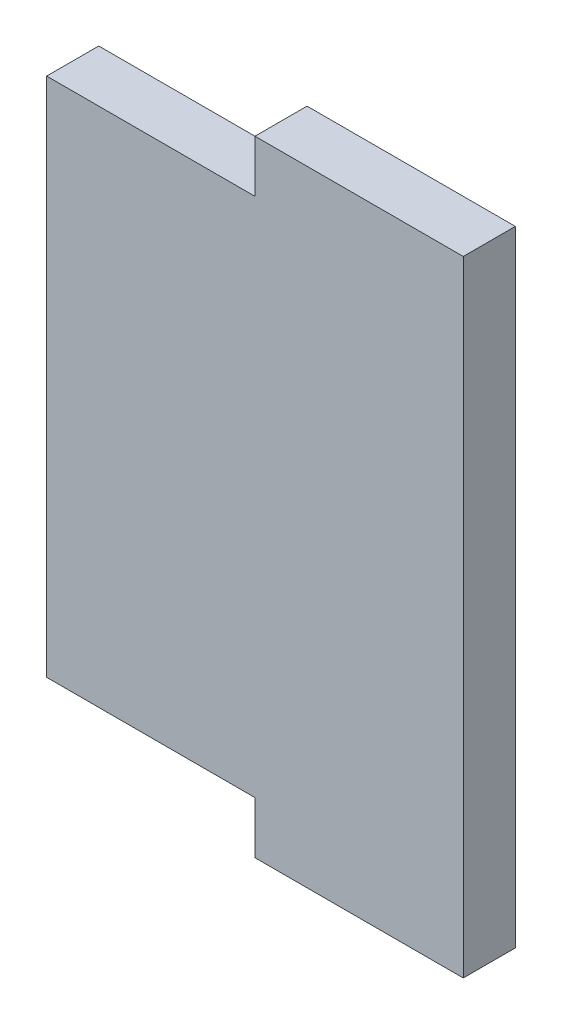
ISO-10303-21;
HEADER;
FILE_DESCRIPTION(('STEP AP214'),'2;1');
FILE_NAME('part.step','',(''),(''),'','','');
FILE_SCHEMA(('AUTOMOTIVE_DESIGN { 1 0 10303 214 1 1 1 1 }'));
ENDSEC;
DATA;
#1=APPLICATION_CONTEXT('core data for automotive mechanical design processes');
#2=APPLICATION_PROTOCOL_DEFINITION('international standard','automotive_design',2000,#1);
#3=PRODUCT_CONTEXT('',#1,'mechanical');
#4=PRODUCT('Part','Part','',(#3));
#5=PRODUCT_RELATED_PRODUCT_CATEGORY('part','',(#4));
#6=PRODUCT_DEFINITION_FORMATION('','',#4);
#7=PRODUCT_DEFINITION_CONTEXT('part definition',#1,'design');
#8=PRODUCT_DEFINITION('design','',#6,#7);
#9=PRODUCT_DEFINITION_SHAPE('','',#8);
#10=(LENGTH_UNIT() NAMED_UNIT(*) SI_UNIT(.MILLI.,.METRE.));
#11=(NAMED_UNIT(*) PLANE_ANGLE_UNIT() SI_UNIT($,.RADIAN.));
#12=(NAMED_UNIT(*) SI_UNIT($,.STERADIAN.) SOLID_ANGLE_UNIT());
#13=UNCERTAINTY_MEASURE_WITH_UNIT(LENGTH_MEASURE(1.E-05),#10,'distance_accuracy_value','');
#14=(GEOMETRIC_REPRESENTATION_CONTEXT(3) GLOBAL_UNCERTAINTY_ASSIGNED_CONTEXT((#13)) GLOBAL_UNIT_ASSIGNED_CONTEXT((#10,
#11,#12)) REPRESENTATION_CONTEXT('',''));
#15=CARTESIAN_POINT('',(0.,0.,0.));
#16=DIRECTION('',(0.,0.,1.));
#17=DIRECTION('',(1.,0.,0.));
#18=AXIS2_PLACEMENT_3D('',#15,#16,#17);
#19=CARTESIAN_POINT('',(174.625,0.,3.175));
#20=DIRECTION('',(0.,-1.,0.));
#21=DIRECTION('',(0.,0.,-1.));
#22=AXIS2_PLACEMENT_3D('',#19,#20,#21);
#23=PLANE('',#22);
#24=DIRECTION('',(-1.,0.,0.));
#25=VECTOR('',#24,1.);
#26=CARTESIAN_POINT('',(174.625,0.,0.));
#27=LINE('',#26,#25);
#28=CARTESIAN_POINT('',(174.625,0.,0.));
#29=VERTEX_POINT('',#28);
#30=CARTESIAN_POINT('',(161.925,0.,0.));
#31=VERTEX_POINT('',#30);
#32=EDGE_CURVE('E129',#29,#31,#27,.T.);
#33=ORIENTED_EDGE('',*,*,#32,.T.);
#34=DIRECTION('',(0.,0.,-1.));
#35=VECTOR('',#34,1.);
#36=CARTESIAN_POINT('',(161.925,0.,3.175));
#37=LINE('',#36,#35);
#38=CARTESIAN_POINT('',(161.925,0.,3.175));
#39=VERTEX_POINT('',#38);
#40=EDGE_CURVE('E11',#39,#31,#37,.T.);
#41=ORIENTED_EDGE('',*,*,#40,.F.);
#42=DIRECTION('',(-1.,0.,0.));
#43=VECTOR('',#42,1.);
#44=CARTESIAN_POINT('',(174.625,0.,3.175));
#45=LINE('',#44,#43);
#46=CARTESIAN_POINT('',(174.625,0.,3.175));
#47=VERTEX_POINT('',#46);
#48=EDGE_CURVE('E148',#47,#39,#45,.T.);
#49=ORIENTED_EDGE('',*,*,#48,.F.);
#50=DIRECTION('',(0.,0.,-1.));
#51=VECTOR('',#50,1.);
#52=CARTESIAN_POINT('',(174.625,0.,3.175));
#53=LINE('',#52,#51);
#54=EDGE_CURVE('E49',#47,#29,#53,.T.);
#55=ORIENTED_EDGE('',*,*,#54,.T.);
#56=EDGE_LOOP('',(#33,#41,#49,#55));
#57=FACE_BOUND('',#56,.T.);
#58=ADVANCED_FACE('F33',(#57),#23,.F.);
#59=CARTESIAN_POINT('',(161.925,0.,3.175));
#60=DIRECTION('',(1.,0.,0.));
#61=DIRECTION('',(0.,0.,-1.));
#62=AXIS2_PLACEMENT_3D('',#59,#60,#61);
#63=PLANE('',#62);
#64=DIRECTION('',(0.,-1.,0.));
#65=VECTOR('',#64,1.);
#66=CARTESIAN_POINT('',(161.925,0.,0.));
#67=LINE('',#66,#65);
#68=CARTESIAN_POINT('',(161.925,-3.175,0.));
#69=VERTEX_POINT('',#68);
#70=EDGE_CURVE('E131',#31,#69,#67,.T.);
#71=ORIENTED_EDGE('',*,*,#70,.T.);
#72=DIRECTION('',(0.,0.,-1.));
#73=VECTOR('',#72,1.);
#74=CARTESIAN_POINT('',(161.925,-3.175,3.175));
#75=LINE('',#74,#73);
#76=CARTESIAN_POINT('',(161.925,-3.175,3.175));
#77=VERTEX_POINT('',#76);
#78=EDGE_CURVE('E41',#77,#69,#75,.T.);
#79=ORIENTED_EDGE('',*,*,#78,.F.);
#80=DIRECTION('',(0.,-1.,0.));
#81=VECTOR('',#80,1.);
#82=CARTESIAN_POINT('',(161.925,0.,3.175));
#83=LINE('',#82,#81);
#84=EDGE_CURVE('E87',#39,#77,#83,.T.);
#85=ORIENTED_EDGE('',*,*,#84,.F.);
#86=ORIENTED_EDGE('',*,*,#40,.T.);
#87=EDGE_LOOP('',(#71,#79,#85,#86));
#88=FACE_BOUND('',#87,.T.);
#89=ADVANCED_FACE('F162',(#88),#63,.F.);
#90=CARTESIAN_POINT('',(149.225,-3.175,3.175));
#91=DIRECTION('',(0.,1.,0.));
#92=DIRECTION('',(0.,0.,1.));
#93=AXIS2_PLACEMENT_3D('',#90,#91,#92);
#94=PLANE('',#93);
#95=DIRECTION('',(1.,0.,0.));
#96=VECTOR('',#95,1.);
#97=CARTESIAN_POINT('',(149.225,-3.175,0.));
#98=LINE('',#97,#96);
#99=CARTESIAN_POINT('',(149.225,-3.175,0.));
#100=VERTEX_POINT('',#99);
#101=EDGE_CURVE('E134',#100,#69,#98,.T.);
#102=ORIENTED_EDGE('',*,*,#101,.F.);
#103=DIRECTION('',(0.,0.,-1.));
#104=VECTOR('',#103,1.);
#105=CARTESIAN_POINT('',(149.225,-3.175,3.175));
#106=LINE('',#105,#104);
#107=CARTESIAN_POINT('',(149.225,-3.175,3.175));
#108=VERTEX_POINT('',#107);
#109=EDGE_CURVE('E155',#108,#100,#106,.T.);
#110=ORIENTED_EDGE('',*,*,#109,.F.);
#111=DIRECTION('',(1.,0.,0.));
#112=VECTOR('',#111,1.);
#113=CARTESIAN_POINT('',(149.225,-3.175,3.175));
#114=LINE('',#113,#112);
#115=EDGE_CURVE('E161',#108,#77,#114,.T.);
#116=ORIENTED_EDGE('',*,*,#115,.T.);
#117=ORIENTED_EDGE('',*,*,#78,.T.);
#118=EDGE_LOOP('',(#102,#110,#116,#117));
#119=FACE_BOUND('',#118,.T.);
#120=ADVANCED_FACE('F159',(#119),#94,.T.);
#121=CARTESIAN_POINT('',(149.225,-3.175,3.175));
#122=DIRECTION('',(1.,0.,0.));
#123=DIRECTION('',(0.,0.,-1.));
#124=AXIS2_PLACEMENT_3D('',#121,#122,#123);
#125=PLANE('',#124);
#126=DIRECTION('',(0.,-1.,0.));
#127=VECTOR('',#126,1.);
#128=CARTESIAN_POINT('',(149.225,-3.175,0.));
#129=LINE('',#128,#127);
#130=CARTESIAN_POINT('',(149.225,-34.925,0.));
#131=VERTEX_POINT('',#130);
#132=EDGE_CURVE('E137',#100,#131,#129,.T.);
#133=ORIENTED_EDGE('',*,*,#132,.T.);
#134=DIRECTION('',(0.,0.,-1.));
#135=VECTOR('',#134,1.);
#136=CARTESIAN_POINT('',(149.225,-34.925,3.175));
#137=LINE('',#136,#135);
#138=CARTESIAN_POINT('',(149.225,-34.925,3.175));
#139=VERTEX_POINT('',#138);
#140=EDGE_CURVE('E152',#139,#131,#137,.T.);
#141=ORIENTED_EDGE('',*,*,#140,.F.);
#142=DIRECTION('',(0.,-1.,0.));
#143=VECTOR('',#142,1.);
#144=CARTESIAN_POINT('',(149.225,-3.175,3.175));
#145=LINE('',#144,#143);
#146=EDGE_CURVE('E174',#108,#139,#145,.T.);
#147=ORIENTED_EDGE('',*,*,#146,.F.);
#148=ORIENTED_EDGE('',*,*,#109,.T.);
#149=EDGE_LOOP('',(#133,#141,#147,#148));
#150=FACE_BOUND('',#149,.T.);
#151=ADVANCED_FACE('F170',(#150),#125,.F.);
#152=CARTESIAN_POINT('',(149.225,-34.925,3.175));
#153=DIRECTION('',(0.,1.,0.));
#154=DIRECTION('',(0.,0.,1.));
#155=AXIS2_PLACEMENT_3D('',#152,#153,#154);
#156=PLANE('',#155);
#157=DIRECTION('',(1.,0.,0.));
#158=VECTOR('',#157,1.);
#159=CARTESIAN_POINT('',(149.225,-34.925,0.));
#160=LINE('',#159,#158);
#161=CARTESIAN_POINT('',(161.925,-34.925,0.));
#162=VERTEX_POINT('',#161);
#163=EDGE_CURVE('E139',#131,#162,#160,.T.);
#164=ORIENTED_EDGE('',*,*,#163,.T.);
#165=DIRECTION('',(0.,0.,-1.));
#166=VECTOR('',#165,1.);
#167=CARTESIAN_POINT('',(161.925,-34.925,3.175));
#168=LINE('',#167,#166);
#169=CARTESIAN_POINT('',(161.925,-34.925,3.175));
#170=VERTEX_POINT('',#169);
#171=EDGE_CURVE('E112',#170,#162,#168,.T.);
#172=ORIENTED_EDGE('',*,*,#171,.F.);
#173=DIRECTION('',(1.,0.,0.));
#174=VECTOR('',#173,1.);
#175=CARTESIAN_POINT('',(149.225,-34.925,3.175));
#176=LINE('',#175,#174);
#177=EDGE_CURVE('E120',#139,#170,#176,.T.);
#178=ORIENTED_EDGE('',*,*,#177,.F.);
#179=ORIENTED_EDGE('',*,*,#140,.T.);
#180=EDGE_LOOP('',(#164,#172,#178,#179));
#181=FACE_BOUND('',#180,.T.);
#182=ADVANCED_FACE('F173',(#181),#156,.F.);
#183=CARTESIAN_POINT('',(161.925,-38.1,3.175));
#184=DIRECTION('',(-1.,0.,0.));
#185=DIRECTION('',(0.,0.,1.));
#186=AXIS2_PLACEMENT_3D('',#183,#184,#185);
#187=PLANE('',#186);
#188=DIRECTION('',(0.,1.,0.));
#189=VECTOR('',#188,1.);
#190=CARTESIAN_POINT('',(161.925,-38.1,0.));
#191=LINE('',#190,#189);
#192=CARTESIAN_POINT('',(161.925,-38.1,0.));
#193=VERTEX_POINT('',#192);
#194=EDGE_CURVE('E108',#193,#162,#191,.T.);
#195=ORIENTED_EDGE('',*,*,#194,.F.);
#196=DIRECTION('',(0.,0.,-1.));
#197=VECTOR('',#196,1.);
#198=CARTESIAN_POINT('',(161.925,-38.1,3.175));
#199=LINE('',#198,#197);
#200=CARTESIAN_POINT('',(161.925,-38.1,3.175));
#201=VERTEX_POINT('',#200);
#202=EDGE_CURVE('E103',#201,#193,#199,.T.);
#203=ORIENTED_EDGE('',*,*,#202,.F.);
#204=DIRECTION('',(0.,1.,0.));
#205=VECTOR('',#204,1.);
#206=CARTESIAN_POINT('',(161.925,-38.1,3.175));
#207=LINE('',#206,#205);
#208=EDGE_CURVE('E106',#201,#170,#207,.T.);
#209=ORIENTED_EDGE('',*,*,#208,.T.);
#210=ORIENTED_EDGE('',*,*,#171,.T.);
#211=EDGE_LOOP('',(#195,#203,#209,#210));
#212=FACE_BOUND('',#211,.T.);
#213=ADVANCED_FACE('F105',(#212),#187,.T.);
#214=CARTESIAN_POINT('',(174.625,-38.1,3.175));
#215=DIRECTION('',(0.,-1.,0.));
#216=DIRECTION('',(0.,0.,-1.));
#217=AXIS2_PLACEMENT_3D('',#214,#215,#216);
#218=PLANE('',#217);
#219=DIRECTION('',(-1.,0.,0.));
#220=VECTOR('',#219,1.);
#221=CARTESIAN_POINT('',(174.625,-38.1,0.));
#222=LINE('',#221,#220);
#223=CARTESIAN_POINT('',(174.625,-38.1,0.));
#224=VERTEX_POINT('',#223);
#225=EDGE_CURVE('E143',#224,#193,#222,.T.);
#226=ORIENTED_EDGE('',*,*,#225,.F.);
#227=DIRECTION('',(0.,0.,-1.));
#228=VECTOR('',#227,1.);
#229=CARTESIAN_POINT('',(174.625,-38.1,3.175));
#230=LINE('',#229,#228);
#231=CARTESIAN_POINT('',(174.625,-38.1,3.175));
#232=VERTEX_POINT('',#231);
#233=EDGE_CURVE('E75',#232,#224,#230,.T.);
#234=ORIENTED_EDGE('',*,*,#233,.F.);
#235=DIRECTION('',(-1.,0.,0.));
#236=VECTOR('',#235,1.);
#237=CARTESIAN_POINT('',(174.625,-38.1,3.175));
#238=LINE('',#237,#236);
#239=EDGE_CURVE('E118',#232,#201,#238,.T.);
#240=ORIENTED_EDGE('',*,*,#239,.T.);
#241=ORIENTED_EDGE('',*,*,#202,.T.);
#242=EDGE_LOOP('',(#226,#234,#240,#241));
#243=FACE_BOUND('',#242,.T.);
#244=ADVANCED_FACE('F123',(#243),#218,.T.);
#245=CARTESIAN_POINT('',(174.625,0.,3.175));
#246=DIRECTION('',(1.,0.,0.));
#247=DIRECTION('',(0.,0.,-1.));
#248=AXIS2_PLACEMENT_3D('',#245,#246,#247);
#249=PLANE('',#248);
#250=DIRECTION('',(0.,-1.,0.));
#251=VECTOR('',#250,1.);
#252=CARTESIAN_POINT('',(174.625,0.,0.));
#253=LINE('',#252,#251);
#254=EDGE_CURVE('E145',#29,#224,#253,.T.);
#255=ORIENTED_EDGE('',*,*,#254,.F.);
#256=ORIENTED_EDGE('',*,*,#54,.F.);
#257=DIRECTION('',(0.,-1.,0.));
#258=VECTOR('',#257,1.);
#259=CARTESIAN_POINT('',(174.625,0.,3.175));
#260=LINE('',#259,#258);
#261=EDGE_CURVE('E124',#47,#232,#260,.T.);
#262=ORIENTED_EDGE('',*,*,#261,.T.);
#263=ORIENTED_EDGE('',*,*,#233,.T.);
#264=EDGE_LOOP('',(#255,#256,#262,#263));
#265=FACE_BOUND('',#264,.T.);
#266=ADVANCED_FACE('F179',(#265),#249,.T.);
#267=CARTESIAN_POINT('',(0.,0.,3.175));
#268=DIRECTION('',(0.,0.,1.));
#269=DIRECTION('',(1.,0.,0.));
#270=AXIS2_PLACEMENT_3D('',#267,#268,#269);
#271=PLANE('',#270);
#272=ORIENTED_EDGE('',*,*,#48,.T.);
#273=ORIENTED_EDGE('',*,*,#84,.T.);
#274=ORIENTED_EDGE('',*,*,#115,.F.);
#275=ORIENTED_EDGE('',*,*,#146,.T.);
#276=ORIENTED_EDGE('',*,*,#177,.T.);
#277=ORIENTED_EDGE('',*,*,#208,.F.);
#278=ORIENTED_EDGE('',*,*,#239,.F.);
#279=ORIENTED_EDGE('',*,*,#261,.F.);
#280=EDGE_LOOP('',(#272,#273,#274,#275,#276,#277,#278,#279));
#281=FACE_BOUND('',#280,.T.);
#282=ADVANCED_FACE('F116',(#281),#271,.T.);
#283=CARTESIAN_POINT('',(0.,0.,0.));
#284=DIRECTION('',(0.,0.,1.));
#285=DIRECTION('',(1.,0.,0.));
#286=AXIS2_PLACEMENT_3D('',#283,#284,#285);
#287=PLANE('',#286);
#288=ORIENTED_EDGE('',*,*,#32,.F.);
#289=ORIENTED_EDGE('',*,*,#254,.T.);
#290=ORIENTED_EDGE('',*,*,#225,.T.);
#291=ORIENTED_EDGE('',*,*,#194,.T.);
#292=ORIENTED_EDGE('',*,*,#163,.F.);
#293=ORIENTED_EDGE('',*,*,#132,.F.);
#294=ORIENTED_EDGE('',*,*,#101,.T.);
#295=ORIENTED_EDGE('',*,*,#70,.F.);
#296=EDGE_LOOP('',(#288,#289,#290,#291,#292,#293,#294,#295));
#297=FACE_BOUND('',#296,.T.);
#298=ADVANCED_FACE('F166',(#297),#287,.F.);
#299=CLOSED_SHELL('',(#58,#89,#120,#151,#182,#213,#244,#266,#282,#298));
#300=MANIFOLD_SOLID_BREP('B2',#299);
#301=ADVANCED_BREP_SHAPE_REPRESENTATION('',(#18,#300),#14);
#302=SHAPE_DEFINITION_REPRESENTATION(#9,#301);
ENDSEC;
END-ISO-10303-21;
